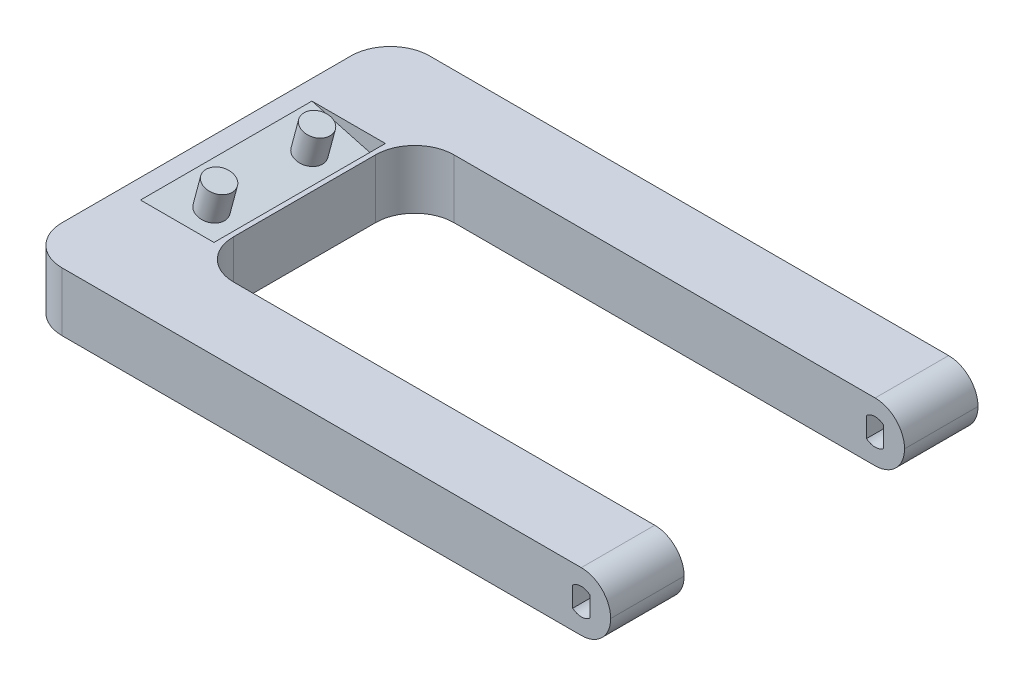
ISO-10303-21;
HEADER;
FILE_DESCRIPTION(('STEP AP214'),'2;1');
FILE_NAME('part.step','',(''),(''),'','','');
FILE_SCHEMA(('AUTOMOTIVE_DESIGN { 1 0 10303 214 1 1 1 1 }'));
ENDSEC;
DATA;
#1=APPLICATION_CONTEXT('core data for automotive mechanical design processes');
#2=APPLICATION_PROTOCOL_DEFINITION('international standard','automotive_design',2000,#1);
#3=PRODUCT_CONTEXT('',#1,'mechanical');
#4=PRODUCT('Part','Part','',(#3));
#5=PRODUCT_RELATED_PRODUCT_CATEGORY('part','',(#4));
#6=PRODUCT_DEFINITION_FORMATION('','',#4);
#7=PRODUCT_DEFINITION_CONTEXT('part definition',#1,'design');
#8=PRODUCT_DEFINITION('design','',#6,#7);
#9=PRODUCT_DEFINITION_SHAPE('','',#8);
#10=(LENGTH_UNIT() NAMED_UNIT(*) SI_UNIT(.MILLI.,.METRE.));
#11=(NAMED_UNIT(*) PLANE_ANGLE_UNIT() SI_UNIT($,.RADIAN.));
#12=(NAMED_UNIT(*) SI_UNIT($,.STERADIAN.) SOLID_ANGLE_UNIT());
#13=UNCERTAINTY_MEASURE_WITH_UNIT(LENGTH_MEASURE(1.E-05),#10,'distance_accuracy_value','');
#14=(GEOMETRIC_REPRESENTATION_CONTEXT(3) GLOBAL_UNCERTAINTY_ASSIGNED_CONTEXT((#13)) GLOBAL_UNIT_ASSIGNED_CONTEXT((#10,
#11,#12)) REPRESENTATION_CONTEXT('',''));
#15=CARTESIAN_POINT('',(0.,0.,0.));
#16=DIRECTION('',(0.,0.,1.));
#17=DIRECTION('',(1.,0.,0.));
#18=AXIS2_PLACEMENT_3D('',#15,#16,#17);
#19=CARTESIAN_POINT('',(-70.,6.,-37.5));
#20=DIRECTION('',(0.,0.,1.));
#21=DIRECTION('',(1.,0.,0.));
#22=AXIS2_PLACEMENT_3D('',#19,#20,#21);
#23=PLANE('',#22);
#24=DIRECTION('',(0.,-1.,0.));
#25=VECTOR('',#24,1.);
#26=CARTESIAN_POINT('',(42.25,-2.05608851949521,-37.5));
#27=LINE('',#26,#25);
#28=CARTESIAN_POINT('',(42.25,2.05608851949521,-37.5));
#29=VERTEX_POINT('',#28);
#30=CARTESIAN_POINT('',(42.25,-2.05608851949521,-37.5));
#31=VERTEX_POINT('',#30);
#32=EDGE_CURVE('E231',#29,#31,#27,.T.);
#33=ORIENTED_EDGE('',*,*,#32,.T.);
#34=CARTESIAN_POINT('',(44.,0.,-37.5));
#35=DIRECTION('',(0.,0.,1.));
#36=DIRECTION('',(1.,0.,0.));
#37=AXIS2_PLACEMENT_3D('',#34,#35,#36);
#38=CIRCLE('',#37,2.7);
#39=CARTESIAN_POINT('',(45.75,-2.05608851949521,-37.5));
#40=VERTEX_POINT('',#39);
#41=EDGE_CURVE('E214',#31,#40,#38,.T.);
#42=ORIENTED_EDGE('',*,*,#41,.T.);
#43=DIRECTION('',(0.,1.,0.));
#44=VECTOR('',#43,1.);
#45=CARTESIAN_POINT('',(45.75,2.05608851949521,-37.5));
#46=LINE('',#45,#44);
#47=CARTESIAN_POINT('',(45.75,2.05608851949521,-37.5));
#48=VERTEX_POINT('',#47);
#49=EDGE_CURVE('E223',#40,#48,#46,.T.);
#50=ORIENTED_EDGE('',*,*,#49,.T.);
#51=CARTESIAN_POINT('',(44.,0.,-37.5));
#52=DIRECTION('',(0.,0.,1.));
#53=DIRECTION('',(1.,0.,0.));
#54=AXIS2_PLACEMENT_3D('',#51,#52,#53);
#55=CIRCLE('',#54,2.7);
#56=EDGE_CURVE('E55',#48,#29,#55,.T.);
#57=ORIENTED_EDGE('',*,*,#56,.T.);
#58=EDGE_LOOP('',(#33,#42,#50,#57));
#59=FACE_BOUND('',#58,.T.);
#60=DIRECTION('',(-1.,0.,0.));
#61=VECTOR('',#60,1.);
#62=CARTESIAN_POINT('',(-70.,-6.,-37.5));
#63=LINE('',#62,#61);
#64=CARTESIAN_POINT('',(44.,-6.,-37.5));
#65=VERTEX_POINT('',#64);
#66=CARTESIAN_POINT('',(-62.,-6.,-37.5));
#67=VERTEX_POINT('',#66);
#68=EDGE_CURVE('E348',#65,#67,#63,.T.);
#69=ORIENTED_EDGE('',*,*,#68,.T.);
#70=DIRECTION('',(0.,-1.,0.));
#71=VECTOR('',#70,1.);
#72=CARTESIAN_POINT('',(-62.,6.,-37.5));
#73=LINE('',#72,#71);
#74=CARTESIAN_POINT('',(-62.,6.,-37.5));
#75=VERTEX_POINT('',#74);
#76=EDGE_CURVE('E429',#67,#75,#73,.F.);
#77=ORIENTED_EDGE('',*,*,#76,.T.);
#78=DIRECTION('',(-1.,0.,0.));
#79=VECTOR('',#78,1.);
#80=CARTESIAN_POINT('',(-70.,6.,-37.5));
#81=LINE('',#80,#79);
#82=CARTESIAN_POINT('',(44.,6.,-37.5));
#83=VERTEX_POINT('',#82);
#84=EDGE_CURVE('E324',#83,#75,#81,.T.);
#85=ORIENTED_EDGE('',*,*,#84,.F.);
#86=CARTESIAN_POINT('',(44.,0.,-37.5));
#87=DIRECTION('',(0.,0.,1.));
#88=DIRECTION('',(1.,0.,0.));
#89=AXIS2_PLACEMENT_3D('',#86,#87,#88);
#90=CIRCLE('',#89,6.);
#91=CARTESIAN_POINT('',(50.,0.,-37.5));
#92=VERTEX_POINT('',#91);
#93=EDGE_CURVE('E379',#83,#92,#90,.F.);
#94=ORIENTED_EDGE('',*,*,#93,.T.);
#95=CARTESIAN_POINT('',(44.,0.,-37.5));
#96=DIRECTION('',(0.,0.,1.));
#97=DIRECTION('',(1.,0.,0.));
#98=AXIS2_PLACEMENT_3D('',#95,#96,#97);
#99=CIRCLE('',#98,6.);
#100=EDGE_CURVE('E376',#92,#65,#99,.F.);
#101=ORIENTED_EDGE('',*,*,#100,.T.);
#102=EDGE_LOOP('',(#69,#77,#85,#94,#101));
#103=FACE_BOUND('',#102,.T.);
#104=ADVANCED_FACE('F39',(#59,#103),#23,.F.);
#105=CARTESIAN_POINT('',(-70.,6.,37.5));
#106=DIRECTION('',(1.,0.,0.));
#107=DIRECTION('',(0.,0.,-1.));
#108=AXIS2_PLACEMENT_3D('',#105,#106,#107);
#109=PLANE('',#108);
#110=DIRECTION('',(0.,0.,1.));
#111=VECTOR('',#110,1.);
#112=CARTESIAN_POINT('',(-70.,6.,37.5));
#113=LINE('',#112,#111);
#114=CARTESIAN_POINT('',(-70.,6.,-29.5));
#115=VERTEX_POINT('',#114);
#116=CARTESIAN_POINT('',(-70.,6.,29.5));
#117=VERTEX_POINT('',#116);
#118=EDGE_CURVE('E328',#115,#117,#113,.T.);
#119=ORIENTED_EDGE('',*,*,#118,.F.);
#120=DIRECTION('',(0.,-1.,0.));
#121=VECTOR('',#120,1.);
#122=CARTESIAN_POINT('',(-70.,6.,-29.5));
#123=LINE('',#122,#121);
#124=CARTESIAN_POINT('',(-70.,-6.,-29.5));
#125=VERTEX_POINT('',#124);
#126=EDGE_CURVE('E419',#115,#125,#123,.T.);
#127=ORIENTED_EDGE('',*,*,#126,.T.);
#128=DIRECTION('',(0.,0.,1.));
#129=VECTOR('',#128,1.);
#130=CARTESIAN_POINT('',(-70.,-6.,37.5));
#131=LINE('',#130,#129);
#132=CARTESIAN_POINT('',(-70.,-6.,29.5));
#133=VERTEX_POINT('',#132);
#134=EDGE_CURVE('E352',#125,#133,#131,.T.);
#135=ORIENTED_EDGE('',*,*,#134,.T.);
#136=DIRECTION('',(0.,-1.,0.));
#137=VECTOR('',#136,1.);
#138=CARTESIAN_POINT('',(-70.,6.,29.5));
#139=LINE('',#138,#137);
#140=EDGE_CURVE('E410',#133,#117,#139,.F.);
#141=ORIENTED_EDGE('',*,*,#140,.T.);
#142=EDGE_LOOP('',(#119,#127,#135,#141));
#143=FACE_BOUND('',#142,.T.);
#144=ADVANCED_FACE('F505',(#143),#109,.F.);
#145=CARTESIAN_POINT('',(50.,6.,37.5));
#146=DIRECTION('',(0.,0.,-1.));
#147=DIRECTION('',(-1.,0.,0.));
#148=AXIS2_PLACEMENT_3D('',#145,#146,#147);
#149=PLANE('',#148);
#150=DIRECTION('',(0.,1.,0.));
#151=VECTOR('',#150,1.);
#152=CARTESIAN_POINT('',(45.75,2.05608851949521,37.5));
#153=LINE('',#152,#151);
#154=CARTESIAN_POINT('',(45.75,-2.05608851949521,37.5));
#155=VERTEX_POINT('',#154);
#156=CARTESIAN_POINT('',(45.75,2.05608851949521,37.5));
#157=VERTEX_POINT('',#156);
#158=EDGE_CURVE('E246',#155,#157,#153,.T.);
#159=ORIENTED_EDGE('',*,*,#158,.F.);
#160=CARTESIAN_POINT('',(44.,0.,37.5));
#161=DIRECTION('',(0.,0.,1.));
#162=DIRECTION('',(1.,0.,0.));
#163=AXIS2_PLACEMENT_3D('',#160,#161,#162);
#164=CIRCLE('',#163,2.7);
#165=CARTESIAN_POINT('',(42.25,-2.05608851949521,37.5));
#166=VERTEX_POINT('',#165);
#167=EDGE_CURVE('E63',#166,#155,#164,.T.);
#168=ORIENTED_EDGE('',*,*,#167,.F.);
#169=DIRECTION('',(0.,-1.,0.));
#170=VECTOR('',#169,1.);
#171=CARTESIAN_POINT('',(42.25,-2.05608851949521,37.5));
#172=LINE('',#171,#170);
#173=CARTESIAN_POINT('',(42.25,2.05608851949521,37.5));
#174=VERTEX_POINT('',#173);
#175=EDGE_CURVE('E233',#174,#166,#172,.T.);
#176=ORIENTED_EDGE('',*,*,#175,.F.);
#177=CARTESIAN_POINT('',(44.,0.,37.5));
#178=DIRECTION('',(0.,0.,1.));
#179=DIRECTION('',(1.,0.,0.));
#180=AXIS2_PLACEMENT_3D('',#177,#178,#179);
#181=CIRCLE('',#180,2.7);
#182=EDGE_CURVE('E237',#157,#174,#181,.T.);
#183=ORIENTED_EDGE('',*,*,#182,.F.);
#184=EDGE_LOOP('',(#159,#168,#176,#183));
#185=FACE_BOUND('',#184,.T.);
#186=DIRECTION('',(1.,0.,0.));
#187=VECTOR('',#186,1.);
#188=CARTESIAN_POINT('',(50.,6.,37.5));
#189=LINE('',#188,#187);
#190=CARTESIAN_POINT('',(-62.,6.,37.5));
#191=VERTEX_POINT('',#190);
#192=CARTESIAN_POINT('',(44.,6.,37.5));
#193=VERTEX_POINT('',#192);
#194=EDGE_CURVE('E333',#191,#193,#189,.T.);
#195=ORIENTED_EDGE('',*,*,#194,.F.);
#196=DIRECTION('',(0.,-1.,0.));
#197=VECTOR('',#196,1.);
#198=CARTESIAN_POINT('',(-62.,6.,37.5));
#199=LINE('',#198,#197);
#200=CARTESIAN_POINT('',(-62.,-6.,37.5));
#201=VERTEX_POINT('',#200);
#202=EDGE_CURVE('E438',#191,#201,#199,.T.);
#203=ORIENTED_EDGE('',*,*,#202,.T.);
#204=DIRECTION('',(1.,0.,0.));
#205=VECTOR('',#204,1.);
#206=CARTESIAN_POINT('',(50.,-6.,37.5));
#207=LINE('',#206,#205);
#208=CARTESIAN_POINT('',(44.,-6.,37.5));
#209=VERTEX_POINT('',#208);
#210=EDGE_CURVE('E357',#201,#209,#207,.T.);
#211=ORIENTED_EDGE('',*,*,#210,.T.);
#212=CARTESIAN_POINT('',(44.,0.,37.5));
#213=DIRECTION('',(0.,0.,-1.));
#214=DIRECTION('',(-1.,0.,0.));
#215=AXIS2_PLACEMENT_3D('',#212,#213,#214);
#216=CIRCLE('',#215,6.);
#217=CARTESIAN_POINT('',(50.,0.,37.5));
#218=VERTEX_POINT('',#217);
#219=EDGE_CURVE('E407',#209,#218,#216,.F.);
#220=ORIENTED_EDGE('',*,*,#219,.T.);
#221=CARTESIAN_POINT('',(44.,0.,37.5));
#222=DIRECTION('',(0.,0.,-1.));
#223=DIRECTION('',(-1.,0.,0.));
#224=AXIS2_PLACEMENT_3D('',#221,#222,#223);
#225=CIRCLE('',#224,6.);
#226=EDGE_CURVE('E403',#218,#193,#225,.F.);
#227=ORIENTED_EDGE('',*,*,#226,.T.);
#228=EDGE_LOOP('',(#195,#203,#211,#220,#227));
#229=FACE_BOUND('',#228,.T.);
#230=ADVANCED_FACE('F510',(#185,#229),#149,.F.);
#231=CARTESIAN_POINT('',(-50.,6.,22.5));
#232=DIRECTION('',(0.,0.,1.));
#233=DIRECTION('',(1.,0.,0.));
#234=AXIS2_PLACEMENT_3D('',#231,#232,#233);
#235=PLANE('',#234);
#236=DIRECTION('',(0.,-1.,0.));
#237=VECTOR('',#236,1.);
#238=CARTESIAN_POINT('',(42.25,6.,22.5));
#239=LINE('',#238,#237);
#240=CARTESIAN_POINT('',(42.25,2.05608851949521,22.5));
#241=VERTEX_POINT('',#240);
#242=CARTESIAN_POINT('',(42.25,-2.05608851949521,22.5));
#243=VERTEX_POINT('',#242);
#244=EDGE_CURVE('E272',#241,#243,#239,.T.);
#245=ORIENTED_EDGE('',*,*,#244,.T.);
#246=CARTESIAN_POINT('',(44.,0.,22.5));
#247=DIRECTION('',(0.,0.,1.));
#248=DIRECTION('',(1.,0.,0.));
#249=AXIS2_PLACEMENT_3D('',#246,#247,#248);
#250=CIRCLE('',#249,2.7);
#251=CARTESIAN_POINT('',(45.75,-2.05608851949521,22.5));
#252=VERTEX_POINT('',#251);
#253=EDGE_CURVE('E276',#243,#252,#250,.T.);
#254=ORIENTED_EDGE('',*,*,#253,.T.);
#255=DIRECTION('',(0.,1.,0.));
#256=VECTOR('',#255,1.);
#257=CARTESIAN_POINT('',(45.75,6.,22.5));
#258=LINE('',#257,#256);
#259=CARTESIAN_POINT('',(45.75,2.05608851949521,22.5));
#260=VERTEX_POINT('',#259);
#261=EDGE_CURVE('E256',#252,#260,#258,.T.);
#262=ORIENTED_EDGE('',*,*,#261,.T.);
#263=CARTESIAN_POINT('',(44.,0.,22.5));
#264=DIRECTION('',(0.,0.,1.));
#265=DIRECTION('',(1.,0.,0.));
#266=AXIS2_PLACEMENT_3D('',#263,#264,#265);
#267=CIRCLE('',#266,2.7);
#268=EDGE_CURVE('E268',#260,#241,#267,.T.);
#269=ORIENTED_EDGE('',*,*,#268,.T.);
#270=EDGE_LOOP('',(#245,#254,#262,#269));
#271=FACE_BOUND('',#270,.T.);
#272=DIRECTION('',(-1.,0.,0.));
#273=VECTOR('',#272,1.);
#274=CARTESIAN_POINT('',(-50.,-6.,22.5));
#275=LINE('',#274,#273);
#276=CARTESIAN_POINT('',(44.,-6.,22.5));
#277=VERTEX_POINT('',#276);
#278=CARTESIAN_POINT('',(-42.,-6.,22.5));
#279=VERTEX_POINT('',#278);
#280=EDGE_CURVE('E360',#277,#279,#275,.T.);
#281=ORIENTED_EDGE('',*,*,#280,.T.);
#282=DIRECTION('',(0.,-1.,0.));
#283=VECTOR('',#282,1.);
#284=CARTESIAN_POINT('',(-42.,6.,22.5));
#285=LINE('',#284,#283);
#286=CARTESIAN_POINT('',(-42.,6.,22.5));
#287=VERTEX_POINT('',#286);
#288=EDGE_CURVE('E453',#279,#287,#285,.F.);
#289=ORIENTED_EDGE('',*,*,#288,.T.);
#290=DIRECTION('',(-1.,0.,0.));
#291=VECTOR('',#290,1.);
#292=CARTESIAN_POINT('',(-50.,6.,22.5));
#293=LINE('',#292,#291);
#294=CARTESIAN_POINT('',(44.,6.,22.5));
#295=VERTEX_POINT('',#294);
#296=EDGE_CURVE('E336',#295,#287,#293,.T.);
#297=ORIENTED_EDGE('',*,*,#296,.F.);
#298=CARTESIAN_POINT('',(44.,0.,22.5));
#299=DIRECTION('',(0.,0.,1.));
#300=DIRECTION('',(1.,0.,0.));
#301=AXIS2_PLACEMENT_3D('',#298,#299,#300);
#302=CIRCLE('',#301,6.);
#303=CARTESIAN_POINT('',(50.,0.,22.5));
#304=VERTEX_POINT('',#303);
#305=EDGE_CURVE('E397',#295,#304,#302,.F.);
#306=ORIENTED_EDGE('',*,*,#305,.T.);
#307=CARTESIAN_POINT('',(44.,0.,22.5));
#308=DIRECTION('',(0.,0.,1.));
#309=DIRECTION('',(1.,0.,0.));
#310=AXIS2_PLACEMENT_3D('',#307,#308,#309);
#311=CIRCLE('',#310,6.);
#312=EDGE_CURVE('E400',#304,#277,#311,.F.);
#313=ORIENTED_EDGE('',*,*,#312,.T.);
#314=EDGE_LOOP('',(#281,#289,#297,#306,#313));
#315=FACE_BOUND('',#314,.T.);
#316=ADVANCED_FACE('F581',(#271,#315),#235,.F.);
#317=CARTESIAN_POINT('',(-50.,6.,-22.5));
#318=DIRECTION('',(-1.,0.,0.));
#319=DIRECTION('',(0.,0.,1.));
#320=AXIS2_PLACEMENT_3D('',#317,#318,#319);
#321=PLANE('',#320);
#322=DIRECTION('',(0.,0.,-1.));
#323=VECTOR('',#322,1.);
#324=CARTESIAN_POINT('',(-50.,-6.,-22.5));
#325=LINE('',#324,#323);
#326=CARTESIAN_POINT('',(-50.,-6.,14.5));
#327=VERTEX_POINT('',#326);
#328=CARTESIAN_POINT('',(-50.,-6.,-14.5));
#329=VERTEX_POINT('',#328);
#330=EDGE_CURVE('E364',#327,#329,#325,.T.);
#331=ORIENTED_EDGE('',*,*,#330,.T.);
#332=DIRECTION('',(0.,-1.,0.));
#333=VECTOR('',#332,1.);
#334=CARTESIAN_POINT('',(-50.,6.,-14.5));
#335=LINE('',#334,#333);
#336=CARTESIAN_POINT('',(-50.,6.,-14.5));
#337=VERTEX_POINT('',#336);
#338=EDGE_CURVE('E450',#329,#337,#335,.F.);
#339=ORIENTED_EDGE('',*,*,#338,.T.);
#340=DIRECTION('',(0.,0.,-1.));
#341=VECTOR('',#340,1.);
#342=CARTESIAN_POINT('',(-50.,6.,-22.5));
#343=LINE('',#342,#341);
#344=CARTESIAN_POINT('',(-50.,6.,14.5));
#345=VERTEX_POINT('',#344);
#346=EDGE_CURVE('E340',#345,#337,#343,.T.);
#347=ORIENTED_EDGE('',*,*,#346,.F.);
#348=DIRECTION('',(0.,-1.,0.));
#349=VECTOR('',#348,1.);
#350=CARTESIAN_POINT('',(-50.,-6.,14.5));
#351=LINE('',#350,#349);
#352=EDGE_CURVE('E446',#345,#327,#351,.T.);
#353=ORIENTED_EDGE('',*,*,#352,.T.);
#354=EDGE_LOOP('',(#331,#339,#347,#353));
#355=FACE_BOUND('',#354,.T.);
#356=ADVANCED_FACE('F586',(#355),#321,.F.);
#357=CARTESIAN_POINT('',(50.,6.,-22.5));
#358=DIRECTION('',(0.,0.,-1.));
#359=DIRECTION('',(-1.,0.,0.));
#360=AXIS2_PLACEMENT_3D('',#357,#358,#359);
#361=PLANE('',#360);
#362=DIRECTION('',(0.,-1.,0.));
#363=VECTOR('',#362,1.);
#364=CARTESIAN_POINT('',(45.75,6.,-22.5));
#365=LINE('',#364,#363);
#366=CARTESIAN_POINT('',(45.75,2.05608851949521,-22.5));
#367=VERTEX_POINT('',#366);
#368=CARTESIAN_POINT('',(45.75,-2.05608851949521,-22.5));
#369=VERTEX_POINT('',#368);
#370=EDGE_CURVE('E476',#367,#369,#365,.T.);
#371=ORIENTED_EDGE('',*,*,#370,.T.);
#372=CARTESIAN_POINT('',(44.,0.,-22.5));
#373=DIRECTION('',(0.,0.,-1.));
#374=DIRECTION('',(-1.,0.,0.));
#375=AXIS2_PLACEMENT_3D('',#372,#373,#374);
#376=CIRCLE('',#375,2.7);
#377=CARTESIAN_POINT('',(42.25,-2.05608851949521,-22.5));
#378=VERTEX_POINT('',#377);
#379=EDGE_CURVE('E11',#369,#378,#376,.T.);
#380=ORIENTED_EDGE('',*,*,#379,.T.);
#381=DIRECTION('',(0.,1.,0.));
#382=VECTOR('',#381,1.);
#383=CARTESIAN_POINT('',(42.25,6.,-22.5));
#384=LINE('',#383,#382);
#385=CARTESIAN_POINT('',(42.25,2.05608851949521,-22.5));
#386=VERTEX_POINT('',#385);
#387=EDGE_CURVE('E48',#378,#386,#384,.T.);
#388=ORIENTED_EDGE('',*,*,#387,.T.);
#389=CARTESIAN_POINT('',(44.,0.,-22.5));
#390=DIRECTION('',(0.,0.,-1.));
#391=DIRECTION('',(-1.,0.,0.));
#392=AXIS2_PLACEMENT_3D('',#389,#390,#391);
#393=CIRCLE('',#392,2.7);
#394=EDGE_CURVE('E479',#386,#367,#393,.T.);
#395=ORIENTED_EDGE('',*,*,#394,.T.);
#396=EDGE_LOOP('',(#371,#380,#388,#395));
#397=FACE_BOUND('',#396,.T.);
#398=DIRECTION('',(1.,0.,0.));
#399=VECTOR('',#398,1.);
#400=CARTESIAN_POINT('',(50.,6.,-22.5));
#401=LINE('',#400,#399);
#402=CARTESIAN_POINT('',(-42.,6.,-22.5));
#403=VERTEX_POINT('',#402);
#404=CARTESIAN_POINT('',(44.,6.,-22.5));
#405=VERTEX_POINT('',#404);
#406=EDGE_CURVE('E344',#403,#405,#401,.T.);
#407=ORIENTED_EDGE('',*,*,#406,.F.);
#408=DIRECTION('',(0.,-1.,0.));
#409=VECTOR('',#408,1.);
#410=CARTESIAN_POINT('',(-42.,-6.,-22.5));
#411=LINE('',#410,#409);
#412=CARTESIAN_POINT('',(-42.,-6.,-22.5));
#413=VERTEX_POINT('',#412);
#414=EDGE_CURVE('E442',#403,#413,#411,.T.);
#415=ORIENTED_EDGE('',*,*,#414,.T.);
#416=DIRECTION('',(1.,0.,0.));
#417=VECTOR('',#416,1.);
#418=CARTESIAN_POINT('',(50.,-6.,-22.5));
#419=LINE('',#418,#417);
#420=CARTESIAN_POINT('',(44.,-6.,-22.5));
#421=VERTEX_POINT('',#420);
#422=EDGE_CURVE('E329',#413,#421,#419,.T.);
#423=ORIENTED_EDGE('',*,*,#422,.T.);
#424=CARTESIAN_POINT('',(44.,0.,-22.5));
#425=DIRECTION('',(0.,0.,-1.));
#426=DIRECTION('',(-1.,0.,0.));
#427=AXIS2_PLACEMENT_3D('',#424,#425,#426);
#428=CIRCLE('',#427,6.);
#429=CARTESIAN_POINT('',(50.,0.,-22.5));
#430=VERTEX_POINT('',#429);
#431=EDGE_CURVE('E382',#421,#430,#428,.F.);
#432=ORIENTED_EDGE('',*,*,#431,.T.);
#433=CARTESIAN_POINT('',(44.,0.,-22.5));
#434=DIRECTION('',(0.,0.,-1.));
#435=DIRECTION('',(-1.,0.,0.));
#436=AXIS2_PLACEMENT_3D('',#433,#434,#435);
#437=CIRCLE('',#436,6.);
#438=EDGE_CURVE('E385',#430,#405,#437,.F.);
#439=ORIENTED_EDGE('',*,*,#438,.T.);
#440=EDGE_LOOP('',(#407,#415,#423,#432,#439));
#441=FACE_BOUND('',#440,.T.);
#442=ADVANCED_FACE('F485',(#397,#441),#361,.F.);
#443=CARTESIAN_POINT('',(0.,6.,0.));
#444=DIRECTION('',(0.,-1.,0.));
#445=DIRECTION('',(0.,0.,-1.));
#446=AXIS2_PLACEMENT_3D('',#443,#444,#445);
#447=PLANE('',#446);
#448=DIRECTION('',(0.,0.,1.));
#449=VECTOR('',#448,1.);
#450=CARTESIAN_POINT('',(-66.,6.,-17.5));
#451=LINE('',#450,#449);
#452=CARTESIAN_POINT('',(-66.,6.,-17.5));
#453=VERTEX_POINT('',#452);
#454=CARTESIAN_POINT('',(-66.,6.,17.5));
#455=VERTEX_POINT('',#454);
#456=EDGE_CURVE('E302',#453,#455,#451,.T.);
#457=ORIENTED_EDGE('',*,*,#456,.F.);
#458=DIRECTION('',(-1.,0.,0.));
#459=VECTOR('',#458,1.);
#460=CARTESIAN_POINT('',(-51.,6.,-17.5));
#461=LINE('',#460,#459);
#462=CARTESIAN_POINT('',(-51.,6.,-17.5));
#463=VERTEX_POINT('',#462);
#464=EDGE_CURVE('E289',#463,#453,#461,.T.);
#465=ORIENTED_EDGE('',*,*,#464,.F.);
#466=DIRECTION('',(0.,0.,1.));
#467=VECTOR('',#466,1.);
#468=CARTESIAN_POINT('',(-51.,6.,-17.5));
#469=LINE('',#468,#467);
#470=CARTESIAN_POINT('',(-51.,6.,17.5));
#471=VERTEX_POINT('',#470);
#472=EDGE_CURVE('E313',#463,#471,#469,.T.);
#473=ORIENTED_EDGE('',*,*,#472,.T.);
#474=DIRECTION('',(-1.,0.,0.));
#475=VECTOR('',#474,1.);
#476=CARTESIAN_POINT('',(-51.,6.,17.5));
#477=LINE('',#476,#475);
#478=EDGE_CURVE('E288',#471,#455,#477,.T.);
#479=ORIENTED_EDGE('',*,*,#478,.T.);
#480=EDGE_LOOP('',(#457,#465,#473,#479));
#481=FACE_BOUND('',#480,.T.);
#482=ORIENTED_EDGE('',*,*,#84,.T.);
#483=CARTESIAN_POINT('',(-62.,6.,-29.5));
#484=DIRECTION('',(0.,-1.,0.));
#485=DIRECTION('',(0.,0.,-1.));
#486=AXIS2_PLACEMENT_3D('',#483,#484,#485);
#487=CIRCLE('',#486,8.);
#488=EDGE_CURVE('E435',#75,#115,#487,.F.);
#489=ORIENTED_EDGE('',*,*,#488,.T.);
#490=ORIENTED_EDGE('',*,*,#118,.T.);
#491=CARTESIAN_POINT('',(-62.,6.,29.5));
#492=DIRECTION('',(0.,-1.,0.));
#493=DIRECTION('',(0.,0.,-1.));
#494=AXIS2_PLACEMENT_3D('',#491,#492,#493);
#495=CIRCLE('',#494,8.);
#496=EDGE_CURVE('E432',#117,#191,#495,.F.);
#497=ORIENTED_EDGE('',*,*,#496,.T.);
#498=ORIENTED_EDGE('',*,*,#194,.T.);
#499=DIRECTION('',(0.,0.,-1.));
#500=VECTOR('',#499,1.);
#501=CARTESIAN_POINT('',(44.,6.,0.));
#502=LINE('',#501,#500);
#503=EDGE_CURVE('E347',#193,#295,#502,.T.);
#504=ORIENTED_EDGE('',*,*,#503,.T.);
#505=ORIENTED_EDGE('',*,*,#296,.T.);
#506=CARTESIAN_POINT('',(-42.,6.,14.5));
#507=DIRECTION('',(0.,-1.,0.));
#508=DIRECTION('',(0.,0.,-1.));
#509=AXIS2_PLACEMENT_3D('',#506,#507,#508);
#510=CIRCLE('',#509,8.);
#511=EDGE_CURVE('E465',#287,#345,#510,.T.);
#512=ORIENTED_EDGE('',*,*,#511,.T.);
#513=ORIENTED_EDGE('',*,*,#346,.T.);
#514=CARTESIAN_POINT('',(-42.,6.,-14.5));
#515=DIRECTION('',(0.,-1.,0.));
#516=DIRECTION('',(0.,0.,-1.));
#517=AXIS2_PLACEMENT_3D('',#514,#515,#516);
#518=CIRCLE('',#517,8.);
#519=EDGE_CURVE('E459',#337,#403,#518,.T.);
#520=ORIENTED_EDGE('',*,*,#519,.T.);
#521=ORIENTED_EDGE('',*,*,#406,.T.);
#522=DIRECTION('',(0.,0.,-1.));
#523=VECTOR('',#522,1.);
#524=CARTESIAN_POINT('',(44.,6.,0.));
#525=LINE('',#524,#523);
#526=EDGE_CURVE('E372',#405,#83,#525,.T.);
#527=ORIENTED_EDGE('',*,*,#526,.T.);
#528=EDGE_LOOP('',(#482,#489,#490,#497,#498,#504,#505,#512,#513,#520,#521,#527));
#529=FACE_BOUND('',#528,.T.);
#530=ADVANCED_FACE('F552',(#481,#529),#447,.F.);
#531=CARTESIAN_POINT('',(0.,-6.,0.));
#532=DIRECTION('',(0.,-1.,0.));
#533=DIRECTION('',(0.,0.,-1.));
#534=AXIS2_PLACEMENT_3D('',#531,#532,#533);
#535=PLANE('',#534);
#536=ORIENTED_EDGE('',*,*,#134,.F.);
#537=CARTESIAN_POINT('',(-62.,-6.,-29.5));
#538=DIRECTION('',(0.,-1.,0.));
#539=DIRECTION('',(0.,0.,-1.));
#540=AXIS2_PLACEMENT_3D('',#537,#538,#539);
#541=CIRCLE('',#540,8.);
#542=EDGE_CURVE('E426',#125,#67,#541,.T.);
#543=ORIENTED_EDGE('',*,*,#542,.T.);
#544=ORIENTED_EDGE('',*,*,#68,.F.);
#545=DIRECTION('',(0.,0.,-1.));
#546=VECTOR('',#545,1.);
#547=CARTESIAN_POINT('',(44.,-6.,-22.5));
#548=LINE('',#547,#546);
#549=EDGE_CURVE('E393',#65,#421,#548,.F.);
#550=ORIENTED_EDGE('',*,*,#549,.T.);
#551=ORIENTED_EDGE('',*,*,#422,.F.);
#552=CARTESIAN_POINT('',(-42.,-6.,-14.5));
#553=DIRECTION('',(0.,-1.,0.));
#554=DIRECTION('',(0.,0.,-1.));
#555=AXIS2_PLACEMENT_3D('',#552,#553,#554);
#556=CIRCLE('',#555,8.);
#557=EDGE_CURVE('E456',#413,#329,#556,.F.);
#558=ORIENTED_EDGE('',*,*,#557,.T.);
#559=ORIENTED_EDGE('',*,*,#330,.F.);
#560=CARTESIAN_POINT('',(-42.,-6.,14.5));
#561=DIRECTION('',(0.,-1.,0.));
#562=DIRECTION('',(0.,0.,-1.));
#563=AXIS2_PLACEMENT_3D('',#560,#561,#562);
#564=CIRCLE('',#563,8.);
#565=EDGE_CURVE('E462',#327,#279,#564,.F.);
#566=ORIENTED_EDGE('',*,*,#565,.T.);
#567=ORIENTED_EDGE('',*,*,#280,.F.);
#568=DIRECTION('',(0.,0.,-1.));
#569=VECTOR('',#568,1.);
#570=CARTESIAN_POINT('',(44.,-6.,37.5));
#571=LINE('',#570,#569);
#572=EDGE_CURVE('E389',#277,#209,#571,.F.);
#573=ORIENTED_EDGE('',*,*,#572,.T.);
#574=ORIENTED_EDGE('',*,*,#210,.F.);
#575=CARTESIAN_POINT('',(-62.,-6.,29.5));
#576=DIRECTION('',(0.,-1.,0.));
#577=DIRECTION('',(0.,0.,-1.));
#578=AXIS2_PLACEMENT_3D('',#575,#576,#577);
#579=CIRCLE('',#578,8.);
#580=EDGE_CURVE('E423',#201,#133,#579,.T.);
#581=ORIENTED_EDGE('',*,*,#580,.T.);
#582=EDGE_LOOP('',(#536,#543,#544,#550,#551,#558,#559,#566,#567,#573,#574,#581));
#583=FACE_BOUND('',#582,.T.);
#584=ADVANCED_FACE('F523',(#583),#535,.T.);
#585=CARTESIAN_POINT('',(44.,0.,-37.5));
#586=DIRECTION('',(0.,0.,1.));
#587=DIRECTION('',(1.,0.,0.));
#588=AXIS2_PLACEMENT_3D('',#585,#586,#587);
#589=CYLINDRICAL_SURFACE('',#588,6.);
#590=DIRECTION('',(0.,0.,-1.));
#591=VECTOR('',#590,1.);
#592=CARTESIAN_POINT('',(50.,0.,-37.5));
#593=LINE('',#592,#591);
#594=EDGE_CURVE('E353',#430,#92,#593,.T.);
#595=ORIENTED_EDGE('',*,*,#594,.F.);
#596=ORIENTED_EDGE('',*,*,#431,.F.);
#597=ORIENTED_EDGE('',*,*,#549,.F.);
#598=ORIENTED_EDGE('',*,*,#100,.F.);
#599=EDGE_LOOP('',(#595,#596,#597,#598));
#600=FACE_BOUND('',#599,.T.);
#601=ADVANCED_FACE('F519',(#600),#589,.T.);
#602=CARTESIAN_POINT('',(44.,0.,0.));
#603=DIRECTION('',(0.,0.,-1.));
#604=DIRECTION('',(-1.,0.,0.));
#605=AXIS2_PLACEMENT_3D('',#602,#603,#604);
#606=CYLINDRICAL_SURFACE('',#605,6.);
#607=ORIENTED_EDGE('',*,*,#438,.F.);
#608=ORIENTED_EDGE('',*,*,#594,.T.);
#609=ORIENTED_EDGE('',*,*,#93,.F.);
#610=ORIENTED_EDGE('',*,*,#526,.F.);
#611=EDGE_LOOP('',(#607,#608,#609,#610));
#612=FACE_BOUND('',#611,.T.);
#613=ADVANCED_FACE('F515',(#612),#606,.T.);
#614=CARTESIAN_POINT('',(44.,0.,0.));
#615=DIRECTION('',(0.,0.,-1.));
#616=DIRECTION('',(-1.,0.,0.));
#617=AXIS2_PLACEMENT_3D('',#614,#615,#616);
#618=CYLINDRICAL_SURFACE('',#617,6.);
#619=ORIENTED_EDGE('',*,*,#503,.F.);
#620=ORIENTED_EDGE('',*,*,#226,.F.);
#621=DIRECTION('',(0.,0.,-1.));
#622=VECTOR('',#621,1.);
#623=CARTESIAN_POINT('',(50.,0.,22.5));
#624=LINE('',#623,#622);
#625=EDGE_CURVE('E317',#304,#218,#624,.F.);
#626=ORIENTED_EDGE('',*,*,#625,.F.);
#627=ORIENTED_EDGE('',*,*,#305,.F.);
#628=EDGE_LOOP('',(#619,#620,#626,#627));
#629=FACE_BOUND('',#628,.T.);
#630=ADVANCED_FACE('F518',(#629),#618,.T.);
#631=CARTESIAN_POINT('',(44.,0.,22.5));
#632=DIRECTION('',(0.,0.,1.));
#633=DIRECTION('',(1.,0.,0.));
#634=AXIS2_PLACEMENT_3D('',#631,#632,#633);
#635=CYLINDRICAL_SURFACE('',#634,6.);
#636=ORIENTED_EDGE('',*,*,#219,.F.);
#637=ORIENTED_EDGE('',*,*,#572,.F.);
#638=ORIENTED_EDGE('',*,*,#312,.F.);
#639=ORIENTED_EDGE('',*,*,#625,.T.);
#640=EDGE_LOOP('',(#636,#637,#638,#639));
#641=FACE_BOUND('',#640,.T.);
#642=ADVANCED_FACE('F525',(#641),#635,.T.);
#643=CARTESIAN_POINT('',(-62.,6.,-29.5));
#644=DIRECTION('',(0.,-1.,0.));
#645=DIRECTION('',(0.,0.,-1.));
#646=AXIS2_PLACEMENT_3D('',#643,#644,#645);
#647=CYLINDRICAL_SURFACE('',#646,8.);
#648=ORIENTED_EDGE('',*,*,#488,.F.);
#649=ORIENTED_EDGE('',*,*,#76,.F.);
#650=ORIENTED_EDGE('',*,*,#542,.F.);
#651=ORIENTED_EDGE('',*,*,#126,.F.);
#652=EDGE_LOOP('',(#648,#649,#650,#651));
#653=FACE_BOUND('',#652,.T.);
#654=ADVANCED_FACE('F528',(#653),#647,.T.);
#655=CARTESIAN_POINT('',(-62.,6.,29.5));
#656=DIRECTION('',(0.,-1.,0.));
#657=DIRECTION('',(0.,0.,-1.));
#658=AXIS2_PLACEMENT_3D('',#655,#656,#657);
#659=CYLINDRICAL_SURFACE('',#658,8.);
#660=ORIENTED_EDGE('',*,*,#496,.F.);
#661=ORIENTED_EDGE('',*,*,#140,.F.);
#662=ORIENTED_EDGE('',*,*,#580,.F.);
#663=ORIENTED_EDGE('',*,*,#202,.F.);
#664=EDGE_LOOP('',(#660,#661,#662,#663));
#665=FACE_BOUND('',#664,.T.);
#666=ADVANCED_FACE('F535',(#665),#659,.T.);
#667=CARTESIAN_POINT('',(-42.,6.,-14.5));
#668=DIRECTION('',(0.,1.,0.));
#669=DIRECTION('',(0.,0.,1.));
#670=AXIS2_PLACEMENT_3D('',#667,#668,#669);
#671=CYLINDRICAL_SURFACE('',#670,8.);
#672=ORIENTED_EDGE('',*,*,#519,.F.);
#673=ORIENTED_EDGE('',*,*,#338,.F.);
#674=ORIENTED_EDGE('',*,*,#557,.F.);
#675=ORIENTED_EDGE('',*,*,#414,.F.);
#676=EDGE_LOOP('',(#672,#673,#674,#675));
#677=FACE_BOUND('',#676,.T.);
#678=ADVANCED_FACE('F538',(#677),#671,.F.);
#679=CARTESIAN_POINT('',(-42.,6.,14.5));
#680=DIRECTION('',(0.,1.,0.));
#681=DIRECTION('',(0.,0.,1.));
#682=AXIS2_PLACEMENT_3D('',#679,#680,#681);
#683=CYLINDRICAL_SURFACE('',#682,8.);
#684=ORIENTED_EDGE('',*,*,#511,.F.);
#685=ORIENTED_EDGE('',*,*,#288,.F.);
#686=ORIENTED_EDGE('',*,*,#565,.F.);
#687=ORIENTED_EDGE('',*,*,#352,.F.);
#688=EDGE_LOOP('',(#684,#685,#686,#687));
#689=FACE_BOUND('',#688,.T.);
#690=ADVANCED_FACE('F41',(#689),#683,.F.);
#691=CARTESIAN_POINT('',(-51.,1.98076211353327,-17.5));
#692=DIRECTION('',(1.,0.,0.));
#693=DIRECTION('',(0.,0.,-1.));
#694=AXIS2_PLACEMENT_3D('',#691,#692,#693);
#695=PLANE('',#694);
#696=DIRECTION('',(0.,1.,0.));
#697=VECTOR('',#696,1.);
#698=CARTESIAN_POINT('',(-51.,1.98076211353327,17.5));
#699=LINE('',#698,#697);
#700=CARTESIAN_POINT('',(-51.,1.98076211353327,17.5));
#701=VERTEX_POINT('',#700);
#702=EDGE_CURVE('E294',#701,#471,#699,.T.);
#703=ORIENTED_EDGE('',*,*,#702,.T.);
#704=ORIENTED_EDGE('',*,*,#472,.F.);
#705=DIRECTION('',(0.,1.,0.));
#706=VECTOR('',#705,1.);
#707=CARTESIAN_POINT('',(-51.,1.98076211353327,-17.5));
#708=LINE('',#707,#706);
#709=CARTESIAN_POINT('',(-51.,1.98076211353327,-17.5));
#710=VERTEX_POINT('',#709);
#711=EDGE_CURVE('E298',#710,#463,#708,.T.);
#712=ORIENTED_EDGE('',*,*,#711,.F.);
#713=DIRECTION('',(0.,0.,1.));
#714=VECTOR('',#713,1.);
#715=CARTESIAN_POINT('',(-51.,1.98076211353327,-17.5));
#716=LINE('',#715,#714);
#717=EDGE_CURVE('E318',#710,#701,#716,.T.);
#718=ORIENTED_EDGE('',*,*,#717,.T.);
#719=EDGE_LOOP('',(#703,#704,#712,#718));
#720=FACE_BOUND('',#719,.T.);
#721=ADVANCED_FACE('F545',(#720),#695,.F.);
#722=CARTESIAN_POINT('',(-66.,6.,-17.5));
#723=DIRECTION('',(-0.258819045102514,-0.96592582628907,0.));
#724=DIRECTION('',(0.96592582628907,-0.258819045102514,0.));
#725=AXIS2_PLACEMENT_3D('',#722,#723,#724);
#726=PLANE('',#725);
#727=CARTESIAN_POINT('',(-59.0024047358083,4.12500000000004,10.));
#728=DIRECTION('',(-0.258819045102514,-0.96592582628907,0.));
#729=DIRECTION('',(0.96592582628907,-0.258819045102514,0.));
#730=AXIS2_PLACEMENT_3D('',#727,#728,#729);
#731=CIRCLE('',#730,2.75);
#732=CARTESIAN_POINT('',(-56.3461087135134,3.41324762596813,10.));
#733=VERTEX_POINT('',#732);
#734=EDGE_CURVE('E472',#733,#733,#731,.F.);
#735=ORIENTED_EDGE('',*,*,#734,.F.);
#736=EDGE_LOOP('',(#735));
#737=FACE_BOUND('',#736,.T.);
#738=CARTESIAN_POINT('',(-59.0024047358083,4.12500000000004,-10.));
#739=DIRECTION('',(-0.258819045102514,-0.96592582628907,0.));
#740=DIRECTION('',(0.96592582628907,-0.258819045102514,0.));
#741=AXIS2_PLACEMENT_3D('',#738,#739,#740);
#742=CIRCLE('',#741,2.75);
#743=CARTESIAN_POINT('',(-56.3461087135134,3.41324762596813,-10.));
#744=VERTEX_POINT('',#743);
#745=EDGE_CURVE('E468',#744,#744,#742,.F.);
#746=ORIENTED_EDGE('',*,*,#745,.F.);
#747=EDGE_LOOP('',(#746));
#748=FACE_BOUND('',#747,.T.);
#749=DIRECTION('',(0.96592582628907,-0.258819045102514,0.));
#750=VECTOR('',#749,1.);
#751=CARTESIAN_POINT('',(-66.,6.,17.5));
#752=LINE('',#751,#750);
#753=EDGE_CURVE('E306',#455,#701,#752,.T.);
#754=ORIENTED_EDGE('',*,*,#753,.T.);
#755=ORIENTED_EDGE('',*,*,#717,.F.);
#756=DIRECTION('',(0.96592582628907,-0.258819045102514,0.));
#757=VECTOR('',#756,1.);
#758=CARTESIAN_POINT('',(-66.,6.,-17.5));
#759=LINE('',#758,#757);
#760=EDGE_CURVE('E293',#453,#710,#759,.T.);
#761=ORIENTED_EDGE('',*,*,#760,.F.);
#762=ORIENTED_EDGE('',*,*,#456,.T.);
#763=EDGE_LOOP('',(#754,#755,#761,#762));
#764=FACE_BOUND('',#763,.T.);
#765=ADVANCED_FACE('F652',(#737,#748,#764),#726,.F.);
#766=CARTESIAN_POINT('',(0.,0.,-17.5));
#767=DIRECTION('',(0.,0.,-1.));
#768=DIRECTION('',(-1.,0.,0.));
#769=AXIS2_PLACEMENT_3D('',#766,#767,#768);
#770=PLANE('',#769);
#771=ORIENTED_EDGE('',*,*,#464,.T.);
#772=ORIENTED_EDGE('',*,*,#760,.T.);
#773=ORIENTED_EDGE('',*,*,#711,.T.);
#774=EDGE_LOOP('',(#771,#772,#773));
#775=FACE_BOUND('',#774,.T.);
#776=ADVANCED_FACE('F649',(#775),#770,.F.);
#777=CARTESIAN_POINT('',(0.,0.,17.5));
#778=DIRECTION('',(0.,0.,-1.));
#779=DIRECTION('',(-1.,0.,0.));
#780=AXIS2_PLACEMENT_3D('',#777,#778,#779);
#781=PLANE('',#780);
#782=ORIENTED_EDGE('',*,*,#478,.F.);
#783=ORIENTED_EDGE('',*,*,#702,.F.);
#784=ORIENTED_EDGE('',*,*,#753,.F.);
#785=EDGE_LOOP('',(#782,#783,#784));
#786=FACE_BOUND('',#785,.T.);
#787=ADVANCED_FACE('F647',(#786),#781,.T.);
#788=CARTESIAN_POINT('',(-57.4494904651933,9.92055495773447,-10.));
#789=DIRECTION('',(-0.258819045102514,-0.96592582628907,0.));
#790=DIRECTION('',(0.96592582628907,-0.258819045102514,0.));
#791=AXIS2_PLACEMENT_3D('',#788,#789,#790);
#792=CYLINDRICAL_SURFACE('',#791,2.75);
#793=CARTESIAN_POINT('',(-57.4494904651933,9.92055495773447,-10.));
#794=DIRECTION('',(0.258819045102514,0.96592582628907,0.));
#795=DIRECTION('',(-0.96592582628907,0.258819045102514,0.));
#796=AXIS2_PLACEMENT_3D('',#793,#794,#795);
#797=CIRCLE('',#796,2.75);
#798=CARTESIAN_POINT('',(-60.1057864874882,10.6323073317664,-10.));
#799=VERTEX_POINT('',#798);
#800=EDGE_CURVE('E284',#799,#799,#797,.T.);
#801=ORIENTED_EDGE('',*,*,#800,.F.);
#802=EDGE_LOOP('',(#801));
#803=FACE_BOUND('',#802,.T.);
#804=ORIENTED_EDGE('',*,*,#745,.T.);
#805=EDGE_LOOP('',(#804));
#806=FACE_BOUND('',#805,.T.);
#807=ADVANCED_FACE('F643',(#803,#806),#792,.T.);
#808=CARTESIAN_POINT('',(-57.4494904651933,9.92055495773447,-10.));
#809=DIRECTION('',(0.258819045102514,0.96592582628907,0.));
#810=DIRECTION('',(-0.96592582628907,0.258819045102514,0.));
#811=AXIS2_PLACEMENT_3D('',#808,#809,#810);
#812=PLANE('',#811);
#813=ORIENTED_EDGE('',*,*,#800,.T.);
#814=EDGE_LOOP('',(#813));
#815=FACE_BOUND('',#814,.T.);
#816=ADVANCED_FACE('F639',(#815),#812,.T.);
#817=CARTESIAN_POINT('',(-57.4494904651933,9.92055495773447,10.));
#818=DIRECTION('',(-0.258819045102514,-0.96592582628907,0.));
#819=DIRECTION('',(0.96592582628907,-0.258819045102514,0.));
#820=AXIS2_PLACEMENT_3D('',#817,#818,#819);
#821=CYLINDRICAL_SURFACE('',#820,2.75);
#822=CARTESIAN_POINT('',(-57.4494904651933,9.92055495773447,10.));
#823=DIRECTION('',(0.258819045102514,0.96592582628907,0.));
#824=DIRECTION('',(-0.96592582628907,0.258819045102514,0.));
#825=AXIS2_PLACEMENT_3D('',#822,#823,#824);
#826=CIRCLE('',#825,2.75);
#827=CARTESIAN_POINT('',(-60.1057864874882,10.6323073317664,10.));
#828=VERTEX_POINT('',#827);
#829=EDGE_CURVE('E280',#828,#828,#826,.T.);
#830=ORIENTED_EDGE('',*,*,#829,.F.);
#831=EDGE_LOOP('',(#830));
#832=FACE_BOUND('',#831,.T.);
#833=ORIENTED_EDGE('',*,*,#734,.T.);
#834=EDGE_LOOP('',(#833));
#835=FACE_BOUND('',#834,.T.);
#836=ADVANCED_FACE('F635',(#832,#835),#821,.T.);
#837=CARTESIAN_POINT('',(-57.4494904651933,9.92055495773447,10.));
#838=DIRECTION('',(0.258819045102514,0.96592582628907,0.));
#839=DIRECTION('',(-0.96592582628907,0.258819045102514,0.));
#840=AXIS2_PLACEMENT_3D('',#837,#838,#839);
#841=PLANE('',#840);
#842=ORIENTED_EDGE('',*,*,#829,.T.);
#843=EDGE_LOOP('',(#842));
#844=FACE_BOUND('',#843,.T.);
#845=ADVANCED_FACE('F499',(#844),#841,.T.);
#846=CARTESIAN_POINT('',(45.75,2.05608851949521,-37.5));
#847=DIRECTION('',(1.,0.,0.));
#848=DIRECTION('',(0.,0.,-1.));
#849=AXIS2_PLACEMENT_3D('',#846,#847,#848);
#850=PLANE('',#849);
#851=DIRECTION('',(0.,0.,1.));
#852=VECTOR('',#851,1.);
#853=CARTESIAN_POINT('',(45.75,2.05608851949521,-37.5));
#854=LINE('',#853,#852);
#855=EDGE_CURVE('E225',#48,#367,#854,.T.);
#856=ORIENTED_EDGE('',*,*,#855,.F.);
#857=ORIENTED_EDGE('',*,*,#49,.F.);
#858=DIRECTION('',(0.,0.,1.));
#859=VECTOR('',#858,1.);
#860=CARTESIAN_POINT('',(45.75,-2.05608851949521,-37.5));
#861=LINE('',#860,#859);
#862=EDGE_CURVE('E209',#40,#369,#861,.T.);
#863=ORIENTED_EDGE('',*,*,#862,.T.);
#864=ORIENTED_EDGE('',*,*,#370,.F.);
#865=EDGE_LOOP('',(#856,#857,#863,#864));
#866=FACE_BOUND('',#865,.T.);
#867=ADVANCED_FACE('F224',(#866),#850,.F.);
#868=CARTESIAN_POINT('',(44.,0.,-37.5));
#869=DIRECTION('',(0.,0.,1.));
#870=DIRECTION('',(1.,0.,0.));
#871=AXIS2_PLACEMENT_3D('',#868,#869,#870);
#872=CYLINDRICAL_SURFACE('',#871,2.7);
#873=DIRECTION('',(0.,0.,1.));
#874=VECTOR('',#873,1.);
#875=CARTESIAN_POINT('',(42.25,2.05608851949521,-37.5));
#876=LINE('',#875,#874);
#877=EDGE_CURVE('E258',#29,#386,#876,.T.);
#878=ORIENTED_EDGE('',*,*,#877,.F.);
#879=ORIENTED_EDGE('',*,*,#56,.F.);
#880=ORIENTED_EDGE('',*,*,#855,.T.);
#881=ORIENTED_EDGE('',*,*,#394,.F.);
#882=EDGE_LOOP('',(#878,#879,#880,#881));
#883=FACE_BOUND('',#882,.T.);
#884=ADVANCED_FACE('F489',(#883),#872,.F.);
#885=CARTESIAN_POINT('',(42.25,-2.05608851949521,-37.5));
#886=DIRECTION('',(-1.,0.,0.));
#887=DIRECTION('',(0.,0.,1.));
#888=AXIS2_PLACEMENT_3D('',#885,#886,#887);
#889=PLANE('',#888);
#890=DIRECTION('',(0.,0.,1.));
#891=VECTOR('',#890,1.);
#892=CARTESIAN_POINT('',(42.25,-2.05608851949521,-37.5));
#893=LINE('',#892,#891);
#894=EDGE_CURVE('E253',#31,#378,#893,.T.);
#895=ORIENTED_EDGE('',*,*,#894,.F.);
#896=ORIENTED_EDGE('',*,*,#32,.F.);
#897=ORIENTED_EDGE('',*,*,#877,.T.);
#898=ORIENTED_EDGE('',*,*,#387,.F.);
#899=EDGE_LOOP('',(#895,#896,#897,#898));
#900=FACE_BOUND('',#899,.T.);
#901=ADVANCED_FACE('F488',(#900),#889,.F.);
#902=CARTESIAN_POINT('',(44.,0.,-37.5));
#903=DIRECTION('',(0.,0.,1.));
#904=DIRECTION('',(1.,0.,0.));
#905=AXIS2_PLACEMENT_3D('',#902,#903,#904);
#906=CYLINDRICAL_SURFACE('',#905,2.7);
#907=ORIENTED_EDGE('',*,*,#862,.F.);
#908=ORIENTED_EDGE('',*,*,#41,.F.);
#909=ORIENTED_EDGE('',*,*,#894,.T.);
#910=ORIENTED_EDGE('',*,*,#379,.F.);
#911=EDGE_LOOP('',(#907,#908,#909,#910));
#912=FACE_BOUND('',#911,.T.);
#913=ADVANCED_FACE('F211',(#912),#906,.F.);
#914=EDGE_CURVE('E257',#243,#166,#893,.T.);
#915=ORIENTED_EDGE('',*,*,#914,.T.);
#916=ORIENTED_EDGE('',*,*,#167,.T.);
#917=EDGE_CURVE('E220',#252,#155,#861,.T.);
#918=ORIENTED_EDGE('',*,*,#917,.F.);
#919=ORIENTED_EDGE('',*,*,#253,.F.);
#920=EDGE_LOOP('',(#915,#916,#918,#919));
#921=FACE_BOUND('',#920,.T.);
#922=ADVANCED_FACE('F621',(#921),#906,.F.);
#923=EDGE_CURVE('E262',#241,#174,#876,.T.);
#924=ORIENTED_EDGE('',*,*,#923,.T.);
#925=ORIENTED_EDGE('',*,*,#175,.T.);
#926=ORIENTED_EDGE('',*,*,#914,.F.);
#927=ORIENTED_EDGE('',*,*,#244,.F.);
#928=EDGE_LOOP('',(#924,#925,#926,#927));
#929=FACE_BOUND('',#928,.T.);
#930=ADVANCED_FACE('F498',(#929),#889,.F.);
#931=EDGE_CURVE('E219',#260,#157,#854,.T.);
#932=ORIENTED_EDGE('',*,*,#931,.T.);
#933=ORIENTED_EDGE('',*,*,#182,.T.);
#934=ORIENTED_EDGE('',*,*,#923,.F.);
#935=ORIENTED_EDGE('',*,*,#268,.F.);
#936=EDGE_LOOP('',(#932,#933,#934,#935));
#937=FACE_BOUND('',#936,.T.);
#938=ADVANCED_FACE('F492',(#937),#872,.F.);
#939=ORIENTED_EDGE('',*,*,#917,.T.);
#940=ORIENTED_EDGE('',*,*,#158,.T.);
#941=ORIENTED_EDGE('',*,*,#931,.F.);
#942=ORIENTED_EDGE('',*,*,#261,.F.);
#943=EDGE_LOOP('',(#939,#940,#941,#942));
#944=FACE_BOUND('',#943,.T.);
#945=ADVANCED_FACE('F501',(#944),#850,.F.);
#946=CLOSED_SHELL('',(#104,#144,#230,#316,#356,#442,#530,#584,#601,#613,#630,#642,#654,#666,
#678,#690,#721,#765,#776,#787,#807,#816,#836,#845,#867,#884,#901,#913,#922,#930,#938,#945));
#947=MANIFOLD_SOLID_BREP('B2',#946);
#948=ADVANCED_BREP_SHAPE_REPRESENTATION('',(#18,#947),#14);
#949=SHAPE_DEFINITION_REPRESENTATION(#9,#948);
ENDSEC;
END-ISO-10303-21;
